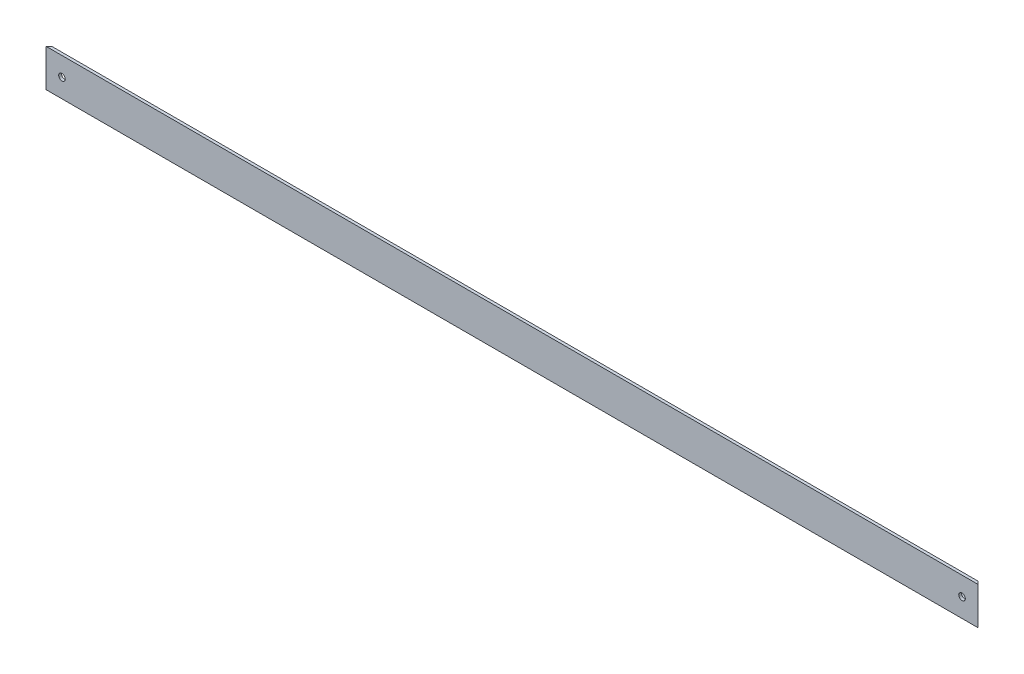
ISO-10303-21;
HEADER;
FILE_DESCRIPTION(('STEP AP214'),'2;1');
FILE_NAME('part.step','',(''),(''),'','','');
FILE_SCHEMA(('AUTOMOTIVE_DESIGN { 1 0 10303 214 1 1 1 1 }'));
ENDSEC;
DATA;
#1=APPLICATION_CONTEXT('core data for automotive mechanical design processes');
#2=APPLICATION_PROTOCOL_DEFINITION('international standard','automotive_design',2000,#1);
#3=PRODUCT_CONTEXT('',#1,'mechanical');
#4=PRODUCT('Part','Part','',(#3));
#5=PRODUCT_RELATED_PRODUCT_CATEGORY('part','',(#4));
#6=PRODUCT_DEFINITION_FORMATION('','',#4);
#7=PRODUCT_DEFINITION_CONTEXT('part definition',#1,'design');
#8=PRODUCT_DEFINITION('design','',#6,#7);
#9=PRODUCT_DEFINITION_SHAPE('','',#8);
#10=(LENGTH_UNIT() NAMED_UNIT(*) SI_UNIT(.MILLI.,.METRE.));
#11=(NAMED_UNIT(*) PLANE_ANGLE_UNIT() SI_UNIT($,.RADIAN.));
#12=(NAMED_UNIT(*) SI_UNIT($,.STERADIAN.) SOLID_ANGLE_UNIT());
#13=UNCERTAINTY_MEASURE_WITH_UNIT(LENGTH_MEASURE(1.E-05),#10,'distance_accuracy_value','');
#14=(GEOMETRIC_REPRESENTATION_CONTEXT(3) GLOBAL_UNCERTAINTY_ASSIGNED_CONTEXT((#13)) GLOBAL_UNIT_ASSIGNED_CONTEXT((#10,
#11,#12)) REPRESENTATION_CONTEXT('',''));
#15=CARTESIAN_POINT('',(0.,0.,0.));
#16=DIRECTION('',(0.,0.,1.));
#17=DIRECTION('',(1.,0.,0.));
#18=AXIS2_PLACEMENT_3D('',#15,#16,#17);
#19=CARTESIAN_POINT('',(496.,0.,0.));
#20=DIRECTION('',(0.,1.,0.));
#21=DIRECTION('',(0.,0.,1.));
#22=AXIS2_PLACEMENT_3D('',#19,#20,#21);
#23=PLANE('',#22);
#24=DIRECTION('',(0.707106781186548,0.,0.707106781186547));
#25=VECTOR('',#24,1.);
#26=CARTESIAN_POINT('',(476.,0.,-20.));
#27=LINE('',#26,#25);
#28=CARTESIAN_POINT('',(476.,0.,-20.));
#29=VERTEX_POINT('',#28);
#30=CARTESIAN_POINT('',(496.,0.,0.));
#31=VERTEX_POINT('',#30);
#32=EDGE_CURVE('E81',#29,#31,#27,.T.);
#33=ORIENTED_EDGE('',*,*,#32,.T.);
#34=DIRECTION('',(-1.,0.,0.));
#35=VECTOR('',#34,1.);
#36=CARTESIAN_POINT('',(496.,0.,0.));
#37=LINE('',#36,#35);
#38=CARTESIAN_POINT('',(0.,0.,0.));
#39=VERTEX_POINT('',#38);
#40=EDGE_CURVE('E11',#31,#39,#37,.T.);
#41=ORIENTED_EDGE('',*,*,#40,.T.);
#42=DIRECTION('',(-0.707106781186548,0.,0.707106781186547));
#43=VECTOR('',#42,1.);
#44=CARTESIAN_POINT('',(20.,0.,-20.));
#45=LINE('',#44,#43);
#46=CARTESIAN_POINT('',(20.,0.,-20.));
#47=VERTEX_POINT('',#46);
#48=EDGE_CURVE('E102',#47,#39,#45,.T.);
#49=ORIENTED_EDGE('',*,*,#48,.F.);
#50=DIRECTION('',(-1.,0.,0.));
#51=VECTOR('',#50,1.);
#52=CARTESIAN_POINT('',(496.,0.,-20.));
#53=LINE('',#52,#51);
#54=EDGE_CURVE('E43',#29,#47,#53,.T.);
#55=ORIENTED_EDGE('',*,*,#54,.F.);
#56=EDGE_LOOP('',(#33,#41,#49,#55));
#57=FACE_BOUND('',#56,.T.);
#58=ADVANCED_FACE('F34',(#57),#23,.F.);
#59=CARTESIAN_POINT('',(496.,0.,-20.));
#60=DIRECTION('',(0.,0.,1.));
#61=DIRECTION('',(1.,0.,0.));
#62=AXIS2_PLACEMENT_3D('',#59,#60,#61);
#63=PLANE('',#62);
#64=DIRECTION('',(0.,-1.,0.));
#65=VECTOR('',#64,1.);
#66=CARTESIAN_POINT('',(476.,20.,-20.));
#67=LINE('',#66,#65);
#68=CARTESIAN_POINT('',(476.,1.5,-20.));
#69=VERTEX_POINT('',#68);
#70=EDGE_CURVE('E84',#69,#29,#67,.T.);
#71=ORIENTED_EDGE('',*,*,#70,.T.);
#72=ORIENTED_EDGE('',*,*,#54,.T.);
#73=DIRECTION('',(0.,-1.,0.));
#74=VECTOR('',#73,1.);
#75=CARTESIAN_POINT('',(20.,20.,-20.));
#76=LINE('',#75,#74);
#77=CARTESIAN_POINT('',(20.,1.5,-20.));
#78=VERTEX_POINT('',#77);
#79=EDGE_CURVE('E122',#78,#47,#76,.T.);
#80=ORIENTED_EDGE('',*,*,#79,.F.);
#81=DIRECTION('',(-1.,0.,0.));
#82=VECTOR('',#81,1.);
#83=CARTESIAN_POINT('',(496.,1.5,-20.));
#84=LINE('',#83,#82);
#85=EDGE_CURVE('E98',#69,#78,#84,.T.);
#86=ORIENTED_EDGE('',*,*,#85,.F.);
#87=EDGE_LOOP('',(#71,#72,#80,#86));
#88=FACE_BOUND('',#87,.T.);
#89=ADVANCED_FACE('F95',(#88),#63,.F.);
#90=CARTESIAN_POINT('',(496.,1.5,-20.));
#91=DIRECTION('',(0.,-1.,0.));
#92=DIRECTION('',(0.,0.,-1.));
#93=AXIS2_PLACEMENT_3D('',#90,#91,#92);
#94=PLANE('',#93);
#95=DIRECTION('',(0.707106781186548,0.,0.707106781186547));
#96=VECTOR('',#95,1.);
#97=CARTESIAN_POINT('',(486.,1.5,-9.99999999999999));
#98=LINE('',#97,#96);
#99=CARTESIAN_POINT('',(494.5,1.5,-1.5));
#100=VERTEX_POINT('',#99);
#101=EDGE_CURVE('E134',#69,#100,#98,.T.);
#102=ORIENTED_EDGE('',*,*,#101,.F.);
#103=ORIENTED_EDGE('',*,*,#85,.T.);
#104=DIRECTION('',(-0.707106781186548,0.,0.707106781186547));
#105=VECTOR('',#104,1.);
#106=CARTESIAN_POINT('',(258.,1.50000000000003,-258.));
#107=LINE('',#106,#105);
#108=CARTESIAN_POINT('',(1.49999999999995,1.5,-1.5));
#109=VERTEX_POINT('',#108);
#110=EDGE_CURVE('E115',#78,#109,#107,.T.);
#111=ORIENTED_EDGE('',*,*,#110,.T.);
#112=DIRECTION('',(-1.,0.,0.));
#113=VECTOR('',#112,1.);
#114=CARTESIAN_POINT('',(496.,1.5,-1.5));
#115=LINE('',#114,#113);
#116=EDGE_CURVE('E103',#100,#109,#115,.T.);
#117=ORIENTED_EDGE('',*,*,#116,.F.);
#118=EDGE_LOOP('',(#102,#103,#111,#117));
#119=FACE_BOUND('',#118,.T.);
#120=ADVANCED_FACE('F156',(#119),#94,.F.);
#121=CARTESIAN_POINT('',(496.,1.5,-1.5));
#122=DIRECTION('',(0.,0.,1.));
#123=DIRECTION('',(0.,-1.,0.));
#124=AXIS2_PLACEMENT_3D('',#121,#122,#123);
#125=PLANE('',#124);
#126=CARTESIAN_POINT('',(487.5,10.,-1.5));
#127=DIRECTION('',(0.,0.,1.));
#128=DIRECTION('',(0.,-1.,0.));
#129=AXIS2_PLACEMENT_3D('',#126,#127,#128);
#130=CIRCLE('',#129,1.75);
#131=CARTESIAN_POINT('',(487.5,8.25,-1.5));
#132=VERTEX_POINT('',#131);
#133=EDGE_CURVE('E138',#132,#132,#130,.T.);
#134=ORIENTED_EDGE('',*,*,#133,.T.);
#135=EDGE_LOOP('',(#134));
#136=FACE_BOUND('',#135,.T.);
#137=CARTESIAN_POINT('',(8.5,10.,-1.5));
#138=DIRECTION('',(0.,0.,1.));
#139=DIRECTION('',(0.,-1.,0.));
#140=AXIS2_PLACEMENT_3D('',#137,#138,#139);
#141=CIRCLE('',#140,1.75);
#142=CARTESIAN_POINT('',(8.5,8.25,-1.5));
#143=VERTEX_POINT('',#142);
#144=EDGE_CURVE('E126',#143,#143,#141,.F.);
#145=ORIENTED_EDGE('',*,*,#144,.F.);
#146=EDGE_LOOP('',(#145));
#147=FACE_BOUND('',#146,.T.);
#148=DIRECTION('',(0.,1.,0.));
#149=VECTOR('',#148,1.);
#150=CARTESIAN_POINT('',(494.5,1.5,-1.5));
#151=LINE('',#150,#149);
#152=CARTESIAN_POINT('',(494.5,20.,-1.50000000000002));
#153=VERTEX_POINT('',#152);
#154=EDGE_CURVE('E99',#100,#153,#151,.T.);
#155=ORIENTED_EDGE('',*,*,#154,.F.);
#156=ORIENTED_EDGE('',*,*,#116,.T.);
#157=DIRECTION('',(0.,1.,0.));
#158=VECTOR('',#157,1.);
#159=CARTESIAN_POINT('',(1.49999999999995,1.50000000000003,-1.5));
#160=LINE('',#159,#158);
#161=CARTESIAN_POINT('',(1.49999999999996,20.,-1.49999999999996));
#162=VERTEX_POINT('',#161);
#163=EDGE_CURVE('E119',#109,#162,#160,.T.);
#164=ORIENTED_EDGE('',*,*,#163,.T.);
#165=DIRECTION('',(-1.,0.,0.));
#166=VECTOR('',#165,1.);
#167=CARTESIAN_POINT('',(496.,20.,-1.5));
#168=LINE('',#167,#166);
#169=EDGE_CURVE('E107',#153,#162,#168,.T.);
#170=ORIENTED_EDGE('',*,*,#169,.F.);
#171=EDGE_LOOP('',(#155,#156,#164,#170));
#172=FACE_BOUND('',#171,.T.);
#173=ADVANCED_FACE('F152',(#136,#147,#172),#125,.F.);
#174=CARTESIAN_POINT('',(496.,20.,-1.5));
#175=DIRECTION('',(0.,-1.,0.));
#176=DIRECTION('',(0.,0.,-1.));
#177=AXIS2_PLACEMENT_3D('',#174,#175,#176);
#178=PLANE('',#177);
#179=DIRECTION('',(0.707106781186548,0.,0.707106781186547));
#180=VECTOR('',#179,1.);
#181=CARTESIAN_POINT('',(476.,20.,-20.));
#182=LINE('',#181,#180);
#183=CARTESIAN_POINT('',(496.,20.,0.));
#184=VERTEX_POINT('',#183);
#185=EDGE_CURVE('E49',#153,#184,#182,.T.);
#186=ORIENTED_EDGE('',*,*,#185,.F.);
#187=ORIENTED_EDGE('',*,*,#169,.T.);
#188=DIRECTION('',(-0.707106781186548,0.,0.707106781186547));
#189=VECTOR('',#188,1.);
#190=CARTESIAN_POINT('',(20.,20.,-20.));
#191=LINE('',#190,#189);
#192=CARTESIAN_POINT('',(0.,20.,0.));
#193=VERTEX_POINT('',#192);
#194=EDGE_CURVE('E124',#162,#193,#191,.T.);
#195=ORIENTED_EDGE('',*,*,#194,.T.);
#196=DIRECTION('',(-1.,0.,0.));
#197=VECTOR('',#196,1.);
#198=CARTESIAN_POINT('',(496.,20.,0.));
#199=LINE('',#198,#197);
#200=EDGE_CURVE('E109',#184,#193,#199,.T.);
#201=ORIENTED_EDGE('',*,*,#200,.F.);
#202=EDGE_LOOP('',(#186,#187,#195,#201));
#203=FACE_BOUND('',#202,.T.);
#204=ADVANCED_FACE('F155',(#203),#178,.F.);
#205=CARTESIAN_POINT('',(496.,20.,0.));
#206=DIRECTION('',(0.,0.,-1.));
#207=DIRECTION('',(-1.,0.,0.));
#208=AXIS2_PLACEMENT_3D('',#205,#206,#207);
#209=PLANE('',#208);
#210=CARTESIAN_POINT('',(487.5,10.,0.));
#211=DIRECTION('',(0.,0.,-1.));
#212=DIRECTION('',(-1.,0.,0.));
#213=AXIS2_PLACEMENT_3D('',#210,#211,#212);
#214=CIRCLE('',#213,1.75);
#215=CARTESIAN_POINT('',(485.75,10.,0.));
#216=VERTEX_POINT('',#215);
#217=EDGE_CURVE('E91',#216,#216,#214,.T.);
#218=ORIENTED_EDGE('',*,*,#217,.T.);
#219=EDGE_LOOP('',(#218));
#220=FACE_BOUND('',#219,.T.);
#221=CARTESIAN_POINT('',(8.5,10.,0.));
#222=DIRECTION('',(0.,0.,1.));
#223=DIRECTION('',(1.,0.,0.));
#224=AXIS2_PLACEMENT_3D('',#221,#222,#223);
#225=CIRCLE('',#224,1.75);
#226=CARTESIAN_POINT('',(10.25,10.,0.));
#227=VERTEX_POINT('',#226);
#228=EDGE_CURVE('E131',#227,#227,#225,.T.);
#229=ORIENTED_EDGE('',*,*,#228,.F.);
#230=EDGE_LOOP('',(#229));
#231=FACE_BOUND('',#230,.T.);
#232=DIRECTION('',(0.,-1.,0.));
#233=VECTOR('',#232,1.);
#234=CARTESIAN_POINT('',(0.,20.,0.));
#235=LINE('',#234,#233);
#236=EDGE_CURVE('E112',#193,#39,#235,.T.);
#237=ORIENTED_EDGE('',*,*,#236,.T.);
#238=ORIENTED_EDGE('',*,*,#40,.F.);
#239=DIRECTION('',(0.,-1.,0.));
#240=VECTOR('',#239,1.);
#241=CARTESIAN_POINT('',(496.,20.,0.));
#242=LINE('',#241,#240);
#243=EDGE_CURVE('E87',#184,#31,#242,.T.);
#244=ORIENTED_EDGE('',*,*,#243,.F.);
#245=ORIENTED_EDGE('',*,*,#200,.T.);
#246=EDGE_LOOP('',(#237,#238,#244,#245));
#247=FACE_BOUND('',#246,.T.);
#248=ADVANCED_FACE('F36',(#220,#231,#247),#209,.F.);
#249=CARTESIAN_POINT('',(20.,20.,-20.));
#250=DIRECTION('',(0.707106781186547,0.,0.707106781186548));
#251=DIRECTION('',(0.707106781186548,0.,-0.707106781186547));
#252=AXIS2_PLACEMENT_3D('',#249,#250,#251);
#253=PLANE('',#252);
#254=ORIENTED_EDGE('',*,*,#79,.T.);
#255=ORIENTED_EDGE('',*,*,#48,.T.);
#256=ORIENTED_EDGE('',*,*,#236,.F.);
#257=ORIENTED_EDGE('',*,*,#194,.F.);
#258=ORIENTED_EDGE('',*,*,#163,.F.);
#259=ORIENTED_EDGE('',*,*,#110,.F.);
#260=EDGE_LOOP('',(#254,#255,#256,#257,#258,#259));
#261=FACE_BOUND('',#260,.T.);
#262=ADVANCED_FACE('F167',(#261),#253,.F.);
#263=CARTESIAN_POINT('',(8.5,10.,-20.001));
#264=DIRECTION('',(0.,0.,1.));
#265=DIRECTION('',(1.,0.,0.));
#266=AXIS2_PLACEMENT_3D('',#263,#264,#265);
#267=CYLINDRICAL_SURFACE('',#266,1.75);
#268=ORIENTED_EDGE('',*,*,#228,.T.);
#269=EDGE_LOOP('',(#268));
#270=FACE_BOUND('',#269,.T.);
#271=ORIENTED_EDGE('',*,*,#144,.T.);
#272=EDGE_LOOP('',(#271));
#273=FACE_BOUND('',#272,.T.);
#274=ADVANCED_FACE('F176',(#270,#273),#267,.F.);
#275=CARTESIAN_POINT('',(476.,20.,-20.));
#276=DIRECTION('',(0.707106781186547,0.,-0.707106781186548));
#277=DIRECTION('',(-0.707106781186548,0.,-0.707106781186547));
#278=AXIS2_PLACEMENT_3D('',#275,#276,#277);
#279=PLANE('',#278);
#280=ORIENTED_EDGE('',*,*,#101,.T.);
#281=ORIENTED_EDGE('',*,*,#154,.T.);
#282=ORIENTED_EDGE('',*,*,#185,.T.);
#283=ORIENTED_EDGE('',*,*,#243,.T.);
#284=ORIENTED_EDGE('',*,*,#32,.F.);
#285=ORIENTED_EDGE('',*,*,#70,.F.);
#286=EDGE_LOOP('',(#280,#281,#282,#283,#284,#285));
#287=FACE_BOUND('',#286,.T.);
#288=ADVANCED_FACE('F83',(#287),#279,.T.);
#289=CARTESIAN_POINT('',(487.5,10.,-20.001));
#290=DIRECTION('',(0.,0.,1.));
#291=DIRECTION('',(1.,0.,0.));
#292=AXIS2_PLACEMENT_3D('',#289,#290,#291);
#293=CYLINDRICAL_SURFACE('',#292,1.75);
#294=ORIENTED_EDGE('',*,*,#217,.F.);
#295=EDGE_LOOP('',(#294));
#296=FACE_BOUND('',#295,.T.);
#297=ORIENTED_EDGE('',*,*,#133,.F.);
#298=EDGE_LOOP('',(#297));
#299=FACE_BOUND('',#298,.T.);
#300=ADVANCED_FACE('F146',(#296,#299),#293,.F.);
#301=CLOSED_SHELL('',(#58,#89,#120,#173,#204,#248,#262,#274,#288,#300));
#302=MANIFOLD_SOLID_BREP('B2',#301);
#303=ADVANCED_BREP_SHAPE_REPRESENTATION('',(#18,#302),#14);
#304=SHAPE_DEFINITION_REPRESENTATION(#9,#303);
ENDSEC;
END-ISO-10303-21;
